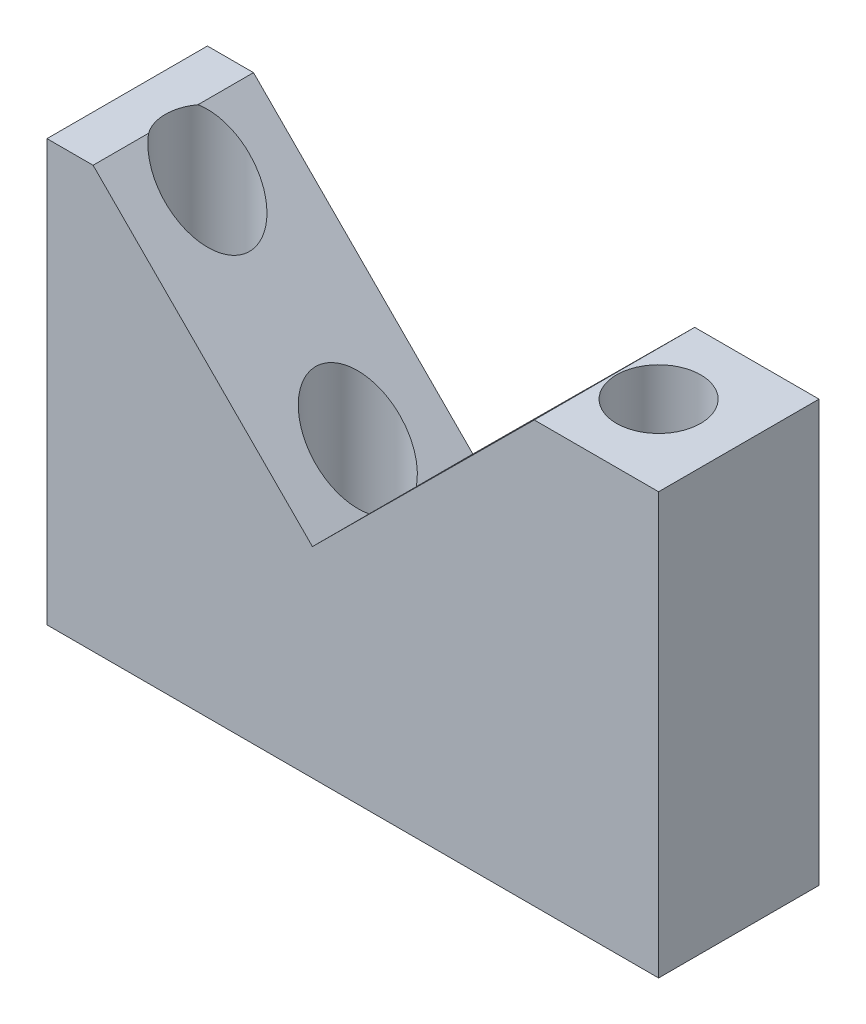
ISO-10303-21;
HEADER;
FILE_DESCRIPTION(('STEP AP214'),'2;1');
FILE_NAME('part.step','',(''),(''),'','','');
FILE_SCHEMA(('AUTOMOTIVE_DESIGN { 1 0 10303 214 1 1 1 1 }'));
ENDSEC;
DATA;
#1=APPLICATION_CONTEXT('core data for automotive mechanical design processes');
#2=APPLICATION_PROTOCOL_DEFINITION('international standard','automotive_design',2000,#1);
#3=PRODUCT_CONTEXT('',#1,'mechanical');
#4=PRODUCT('Part','Part','',(#3));
#5=PRODUCT_RELATED_PRODUCT_CATEGORY('part','',(#4));
#6=PRODUCT_DEFINITION_FORMATION('','',#4);
#7=PRODUCT_DEFINITION_CONTEXT('part definition',#1,'design');
#8=PRODUCT_DEFINITION('design','',#6,#7);
#9=PRODUCT_DEFINITION_SHAPE('','',#8);
#10=(LENGTH_UNIT() NAMED_UNIT(*) SI_UNIT(.MILLI.,.METRE.));
#11=(NAMED_UNIT(*) PLANE_ANGLE_UNIT() SI_UNIT($,.RADIAN.));
#12=(NAMED_UNIT(*) SI_UNIT($,.STERADIAN.) SOLID_ANGLE_UNIT());
#13=UNCERTAINTY_MEASURE_WITH_UNIT(LENGTH_MEASURE(1.E-05),#10,'distance_accuracy_value','');
#14=(GEOMETRIC_REPRESENTATION_CONTEXT(3) GLOBAL_UNCERTAINTY_ASSIGNED_CONTEXT((#13)) GLOBAL_UNIT_ASSIGNED_CONTEXT((#10,
#11,#12)) REPRESENTATION_CONTEXT('',''));
#15=CARTESIAN_POINT('',(0.,0.,0.));
#16=DIRECTION('',(0.,0.,1.));
#17=DIRECTION('',(1.,0.,0.));
#18=AXIS2_PLACEMENT_3D('',#15,#16,#17);
#19=CARTESIAN_POINT('',(-19.5,4.,0.));
#20=DIRECTION('',(1.,0.,0.));
#21=DIRECTION('',(0.,0.,-1.));
#22=AXIS2_PLACEMENT_3D('',#19,#20,#21);
#23=CYLINDRICAL_SURFACE('',#22,2.1);
#24=CARTESIAN_POINT('',(16.,4.,0.));
#25=DIRECTION('',(1.,0.,0.));
#26=DIRECTION('',(0.,0.,-1.));
#27=AXIS2_PLACEMENT_3D('',#24,#25,#26);
#28=CIRCLE('',#27,2.1);
#29=CARTESIAN_POINT('',(16.,5.,1.84661853126194));
#30=VERTEX_POINT('',#29);
#31=CARTESIAN_POINT('',(16.,3.,1.84661853126194));
#32=VERTEX_POINT('',#31);
#33=EDGE_CURVE('E55',#30,#32,#28,.T.);
#34=ORIENTED_EDGE('',*,*,#33,.T.);
#35=CARTESIAN_POINT('',(15.,4.,0.));
#36=DIRECTION('',(-0.707106781186548,-0.707106781186547,0.));
#37=DIRECTION('',(0.707106781186548,-0.707106781186547,0.));
#38=AXIS2_PLACEMENT_3D('',#35,#36,#37);
#39=ELLIPSE('',#38,2.9698484809835,2.1);
#40=CARTESIAN_POINT('',(15.,4.,2.1));
#41=VERTEX_POINT('',#40);
#42=EDGE_CURVE('E283',#32,#41,#39,.T.);
#43=ORIENTED_EDGE('',*,*,#42,.T.);
#44=CARTESIAN_POINT('',(15.,4.,0.));
#45=DIRECTION('',(0.707106781186548,-0.707106781186547,0.));
#46=DIRECTION('',(-0.707106781186548,-0.707106781186547,0.));
#47=AXIS2_PLACEMENT_3D('',#44,#45,#46);
#48=ELLIPSE('',#47,2.9698484809835,2.1);
#49=EDGE_CURVE('E293',#41,#30,#48,.F.);
#50=ORIENTED_EDGE('',*,*,#49,.T.);
#51=EDGE_LOOP('',(#34,#43,#50));
#52=FACE_BOUND('',#51,.T.);
#53=ADVANCED_FACE('F39',(#52),#23,.F.);
#54=CARTESIAN_POINT('',(16.,3.,-1.84661853126193));
#55=VERTEX_POINT('',#54);
#56=CARTESIAN_POINT('',(16.,5.,-1.84661853126193));
#57=VERTEX_POINT('',#56);
#58=EDGE_CURVE('E231',#55,#57,#28,.T.);
#59=ORIENTED_EDGE('',*,*,#58,.T.);
#60=CARTESIAN_POINT('',(15.,4.,-2.1));
#61=VERTEX_POINT('',#60);
#62=EDGE_CURVE('E292',#57,#61,#48,.F.);
#63=ORIENTED_EDGE('',*,*,#62,.T.);
#64=EDGE_CURVE('E284',#61,#55,#39,.T.);
#65=ORIENTED_EDGE('',*,*,#64,.T.);
#66=EDGE_LOOP('',(#59,#63,#65));
#67=FACE_BOUND('',#66,.T.);
#68=ADVANCED_FACE('F572',(#67),#23,.F.);
#69=CARTESIAN_POINT('',(15.,21.,0.));
#70=DIRECTION('',(0.,-1.,0.));
#71=DIRECTION('',(0.,0.,-1.));
#72=AXIS2_PLACEMENT_3D('',#69,#70,#71);
#73=CYLINDRICAL_SURFACE('',#72,2.1);
#74=CARTESIAN_POINT('',(17.,2.,0.640312423743293));
#75=VERTEX_POINT('',#74);
#76=EDGE_CURVE('E226',#75,#32,#39,.T.);
#77=ORIENTED_EDGE('',*,*,#76,.F.);
#78=CARTESIAN_POINT('',(15.,2.,0.));
#79=DIRECTION('',(0.,-1.,0.));
#80=DIRECTION('',(0.,0.,-1.));
#81=AXIS2_PLACEMENT_3D('',#78,#79,#80);
#82=CIRCLE('',#81,2.1);
#83=CARTESIAN_POINT('',(13.,2.,0.640312423743291));
#84=VERTEX_POINT('',#83);
#85=EDGE_CURVE('E208',#75,#84,#82,.T.);
#86=ORIENTED_EDGE('',*,*,#85,.T.);
#87=CARTESIAN_POINT('',(15.,4.,0.));
#88=DIRECTION('',(0.707106781186548,-0.707106781186547,0.));
#89=DIRECTION('',(-0.707106781186548,-0.707106781186547,0.));
#90=AXIS2_PLACEMENT_3D('',#87,#88,#89);
#91=ELLIPSE('',#90,2.9698484809835,2.1);
#92=EDGE_CURVE('E288',#41,#84,#91,.T.);
#93=ORIENTED_EDGE('',*,*,#92,.F.);
#94=ORIENTED_EDGE('',*,*,#42,.F.);
#95=EDGE_LOOP('',(#77,#86,#93,#94));
#96=FACE_BOUND('',#95,.T.);
#97=ADVANCED_FACE('F577',(#96),#73,.F.);
#98=CARTESIAN_POINT('',(13.,2.,-0.64031242374328));
#99=VERTEX_POINT('',#98);
#100=EDGE_CURVE('E287',#99,#61,#91,.T.);
#101=ORIENTED_EDGE('',*,*,#100,.F.);
#102=CARTESIAN_POINT('',(17.,2.,-0.640312423743278));
#103=VERTEX_POINT('',#102);
#104=EDGE_CURVE('E243',#99,#103,#82,.T.);
#105=ORIENTED_EDGE('',*,*,#104,.T.);
#106=CARTESIAN_POINT('',(15.,4.,0.));
#107=DIRECTION('',(-0.707106781186548,-0.707106781186547,0.));
#108=DIRECTION('',(0.707106781186548,-0.707106781186547,0.));
#109=AXIS2_PLACEMENT_3D('',#106,#107,#108);
#110=ELLIPSE('',#109,2.9698484809835,2.1);
#111=EDGE_CURVE('E63',#55,#103,#110,.T.);
#112=ORIENTED_EDGE('',*,*,#111,.F.);
#113=ORIENTED_EDGE('',*,*,#64,.F.);
#114=EDGE_LOOP('',(#101,#105,#112,#113));
#115=FACE_BOUND('',#114,.T.);
#116=ADVANCED_FACE('F637',(#115),#73,.F.);
#117=CARTESIAN_POINT('',(7.5,21.,0.));
#118=DIRECTION('',(0.,-1.,0.));
#119=DIRECTION('',(0.,0.,-1.));
#120=AXIS2_PLACEMENT_3D('',#117,#118,#119);
#121=CYLINDRICAL_SURFACE('',#120,2.1);
#122=CARTESIAN_POINT('',(7.5,4.,0.));
#123=DIRECTION('',(-0.707106781186548,-0.707106781186547,0.));
#124=DIRECTION('',(0.707106781186548,-0.707106781186547,0.));
#125=AXIS2_PLACEMENT_3D('',#122,#123,#124);
#126=ELLIPSE('',#125,2.9698484809835,2.1);
#127=CARTESIAN_POINT('',(9.5,2.,0.64031242374329));
#128=VERTEX_POINT('',#127);
#129=CARTESIAN_POINT('',(7.5,4.,2.1));
#130=VERTEX_POINT('',#129);
#131=EDGE_CURVE('E437',#128,#130,#126,.T.);
#132=ORIENTED_EDGE('',*,*,#131,.F.);
#133=CARTESIAN_POINT('',(7.5,2.,0.));
#134=DIRECTION('',(0.,-1.,0.));
#135=DIRECTION('',(0.,0.,-1.));
#136=AXIS2_PLACEMENT_3D('',#133,#134,#135);
#137=CIRCLE('',#136,2.1);
#138=CARTESIAN_POINT('',(5.5,2.,0.640312423743288));
#139=VERTEX_POINT('',#138);
#140=EDGE_CURVE('E256',#128,#139,#137,.T.);
#141=ORIENTED_EDGE('',*,*,#140,.T.);
#142=CARTESIAN_POINT('',(7.5,4.,0.));
#143=DIRECTION('',(0.707106781186548,-0.707106781186547,0.));
#144=DIRECTION('',(-0.707106781186548,-0.707106781186547,0.));
#145=AXIS2_PLACEMENT_3D('',#142,#143,#144);
#146=ELLIPSE('',#145,2.9698484809835,2.1);
#147=EDGE_CURVE('E444',#130,#139,#146,.T.);
#148=ORIENTED_EDGE('',*,*,#147,.F.);
#149=EDGE_LOOP('',(#132,#141,#148));
#150=FACE_BOUND('',#149,.T.);
#151=ADVANCED_FACE('F474',(#150),#121,.F.);
#152=CARTESIAN_POINT('',(5.5,2.,-0.640312423743283));
#153=VERTEX_POINT('',#152);
#154=CARTESIAN_POINT('',(7.5,4.,-2.1));
#155=VERTEX_POINT('',#154);
#156=EDGE_CURVE('E442',#153,#155,#146,.T.);
#157=ORIENTED_EDGE('',*,*,#156,.F.);
#158=CARTESIAN_POINT('',(9.5,2.,-0.640312423743282));
#159=VERTEX_POINT('',#158);
#160=EDGE_CURVE('E251',#153,#159,#137,.T.);
#161=ORIENTED_EDGE('',*,*,#160,.T.);
#162=EDGE_CURVE('E438',#155,#159,#126,.T.);
#163=ORIENTED_EDGE('',*,*,#162,.F.);
#164=EDGE_LOOP('',(#157,#161,#163));
#165=FACE_BOUND('',#164,.T.);
#166=ADVANCED_FACE('F461',(#165),#121,.F.);
#167=CARTESIAN_POINT('',(0.,21.,0.));
#168=DIRECTION('',(0.,-1.,0.));
#169=DIRECTION('',(0.,0.,-1.));
#170=AXIS2_PLACEMENT_3D('',#167,#168,#169);
#171=CYLINDRICAL_SURFACE('',#170,2.1);
#172=CARTESIAN_POINT('',(0.,4.,0.));
#173=DIRECTION('',(-0.707106781186548,-0.707106781186547,0.));
#174=DIRECTION('',(0.707106781186548,-0.707106781186547,0.));
#175=AXIS2_PLACEMENT_3D('',#172,#173,#174);
#176=ELLIPSE('',#175,2.9698484809835,2.1);
#177=CARTESIAN_POINT('',(2.,2.,0.640312423743287));
#178=VERTEX_POINT('',#177);
#179=CARTESIAN_POINT('',(0.,4.,2.1));
#180=VERTEX_POINT('',#179);
#181=EDGE_CURVE('E319',#178,#180,#176,.T.);
#182=ORIENTED_EDGE('',*,*,#181,.F.);
#183=CARTESIAN_POINT('',(0.,2.,0.));
#184=DIRECTION('',(0.,-1.,0.));
#185=DIRECTION('',(0.,0.,-1.));
#186=AXIS2_PLACEMENT_3D('',#183,#184,#185);
#187=CIRCLE('',#186,2.1);
#188=CARTESIAN_POINT('',(-2.,2.,0.640312423743285));
#189=VERTEX_POINT('',#188);
#190=EDGE_CURVE('E266',#178,#189,#187,.T.);
#191=ORIENTED_EDGE('',*,*,#190,.T.);
#192=CARTESIAN_POINT('',(0.,4.,0.));
#193=DIRECTION('',(0.707106781186548,-0.707106781186547,0.));
#194=DIRECTION('',(-0.707106781186548,-0.707106781186547,0.));
#195=AXIS2_PLACEMENT_3D('',#192,#193,#194);
#196=ELLIPSE('',#195,2.9698484809835,2.1);
#197=EDGE_CURVE('E325',#180,#189,#196,.T.);
#198=ORIENTED_EDGE('',*,*,#197,.F.);
#199=EDGE_LOOP('',(#182,#191,#198));
#200=FACE_BOUND('',#199,.T.);
#201=ADVANCED_FACE('F551',(#200),#171,.F.);
#202=CARTESIAN_POINT('',(-2.,2.,-0.640312423743287));
#203=VERTEX_POINT('',#202);
#204=CARTESIAN_POINT('',(0.,4.,-2.1));
#205=VERTEX_POINT('',#204);
#206=EDGE_CURVE('E324',#203,#205,#196,.T.);
#207=ORIENTED_EDGE('',*,*,#206,.F.);
#208=CARTESIAN_POINT('',(2.,2.,-0.640312423743285));
#209=VERTEX_POINT('',#208);
#210=EDGE_CURVE('E260',#203,#209,#187,.T.);
#211=ORIENTED_EDGE('',*,*,#210,.T.);
#212=EDGE_CURVE('E320',#205,#209,#176,.T.);
#213=ORIENTED_EDGE('',*,*,#212,.F.);
#214=EDGE_LOOP('',(#207,#211,#213));
#215=FACE_BOUND('',#214,.T.);
#216=ADVANCED_FACE('F540',(#215),#171,.F.);
#217=CARTESIAN_POINT('',(-7.5,21.,0.));
#218=DIRECTION('',(0.,-1.,0.));
#219=DIRECTION('',(0.,0.,-1.));
#220=AXIS2_PLACEMENT_3D('',#217,#218,#219);
#221=CYLINDRICAL_SURFACE('',#220,2.1);
#222=CARTESIAN_POINT('',(-7.5,4.,0.));
#223=DIRECTION('',(-0.707106781186548,-0.707106781186547,0.));
#224=DIRECTION('',(0.707106781186548,-0.707106781186547,0.));
#225=AXIS2_PLACEMENT_3D('',#222,#223,#224);
#226=ELLIPSE('',#225,2.9698484809835,2.1);
#227=CARTESIAN_POINT('',(-5.5,2.,0.640312423743283));
#228=VERTEX_POINT('',#227);
#229=CARTESIAN_POINT('',(-7.5,4.,2.1));
#230=VERTEX_POINT('',#229);
#231=EDGE_CURVE('E300',#228,#230,#226,.T.);
#232=ORIENTED_EDGE('',*,*,#231,.F.);
#233=CARTESIAN_POINT('',(-7.5,2.,0.));
#234=DIRECTION('',(0.,-1.,0.));
#235=DIRECTION('',(0.,0.,-1.));
#236=AXIS2_PLACEMENT_3D('',#233,#234,#235);
#237=CIRCLE('',#236,2.1);
#238=CARTESIAN_POINT('',(-9.5,2.,0.640312423743282));
#239=VERTEX_POINT('',#238);
#240=EDGE_CURVE('E275',#228,#239,#237,.T.);
#241=ORIENTED_EDGE('',*,*,#240,.T.);
#242=CARTESIAN_POINT('',(-7.5,4.,0.));
#243=DIRECTION('',(0.707106781186548,-0.707106781186547,0.));
#244=DIRECTION('',(-0.707106781186548,-0.707106781186547,0.));
#245=AXIS2_PLACEMENT_3D('',#242,#243,#244);
#246=ELLIPSE('',#245,2.9698484809835,2.1);
#247=EDGE_CURVE('E307',#230,#239,#246,.T.);
#248=ORIENTED_EDGE('',*,*,#247,.F.);
#249=EDGE_LOOP('',(#232,#241,#248));
#250=FACE_BOUND('',#249,.T.);
#251=ADVANCED_FACE('F614',(#250),#221,.F.);
#252=CARTESIAN_POINT('',(-9.5,2.,-0.64031242374329));
#253=VERTEX_POINT('',#252);
#254=CARTESIAN_POINT('',(-7.5,4.,-2.1));
#255=VERTEX_POINT('',#254);
#256=EDGE_CURVE('E305',#253,#255,#246,.T.);
#257=ORIENTED_EDGE('',*,*,#256,.F.);
#258=CARTESIAN_POINT('',(-5.5,2.,-0.640312423743288));
#259=VERTEX_POINT('',#258);
#260=EDGE_CURVE('E270',#253,#259,#237,.T.);
#261=ORIENTED_EDGE('',*,*,#260,.T.);
#262=EDGE_CURVE('E301',#255,#259,#226,.T.);
#263=ORIENTED_EDGE('',*,*,#262,.F.);
#264=EDGE_LOOP('',(#257,#261,#263));
#265=FACE_BOUND('',#264,.T.);
#266=ADVANCED_FACE('F623',(#265),#221,.F.);
#267=CARTESIAN_POINT('',(0.,4.,0.));
#268=DIRECTION('',(0.707106781186548,-0.707106781186547,0.));
#269=DIRECTION('',(-0.707106781186548,-0.707106781186547,0.));
#270=AXIS2_PLACEMENT_3D('',#267,#268,#269);
#271=ELLIPSE('',#270,2.9698484809835,2.1);
#272=EDGE_CURVE('E329',#180,#205,#271,.F.);
#273=ORIENTED_EDGE('',*,*,#272,.F.);
#274=CARTESIAN_POINT('',(0.,4.,0.));
#275=DIRECTION('',(-0.707106781186548,-0.707106781186547,0.));
#276=DIRECTION('',(0.707106781186548,-0.707106781186547,0.));
#277=AXIS2_PLACEMENT_3D('',#274,#275,#276);
#278=ELLIPSE('',#277,2.9698484809835,2.1);
#279=EDGE_CURVE('E315',#205,#180,#278,.F.);
#280=ORIENTED_EDGE('',*,*,#279,.F.);
#281=EDGE_LOOP('',(#273,#280));
#282=FACE_BOUND('',#281,.T.);
#283=CARTESIAN_POINT('',(0.,8.27128979281552,0.));
#284=DIRECTION('',(0.705129412033409,-0.709078636178964,0.));
#285=DIRECTION('',(-0.709078636178964,-0.705129412033409,0.));
#286=AXIS2_PLACEMENT_3D('',#283,#284,#285);
#287=ELLIPSE('',#286,2.96158972059339,2.1);
#288=CARTESIAN_POINT('',(1.73839220877791,10.,-1.17813094707687));
#289=VERTEX_POINT('',#288);
#290=CARTESIAN_POINT('',(1.73839220877791,10.,1.17813094707687));
#291=VERTEX_POINT('',#290);
#292=EDGE_CURVE('E358',#289,#291,#287,.T.);
#293=ORIENTED_EDGE('',*,*,#292,.F.);
#294=CARTESIAN_POINT('',(0.,11.7481284364379,0.));
#295=DIRECTION('',(-0.709078636178956,-0.705129412033417,0.));
#296=DIRECTION('',(0.705129412033417,-0.709078636178956,0.));
#297=AXIS2_PLACEMENT_3D('',#294,#295,#296);
#298=ELLIPSE('',#297,2.9781767207017,2.1);
#299=EDGE_CURVE('E366',#291,#289,#298,.T.);
#300=ORIENTED_EDGE('',*,*,#299,.F.);
#301=EDGE_LOOP('',(#293,#300));
#302=FACE_BOUND('',#301,.T.);
#303=ADVANCED_FACE('F497',(#282,#302),#171,.F.);
#304=CARTESIAN_POINT('',(-7.5,4.,0.));
#305=DIRECTION('',(0.707106781186548,-0.707106781186547,0.));
#306=DIRECTION('',(-0.707106781186548,-0.707106781186547,0.));
#307=AXIS2_PLACEMENT_3D('',#304,#305,#306);
#308=ELLIPSE('',#307,2.9698484809835,2.1);
#309=EDGE_CURVE('E311',#230,#255,#308,.F.);
#310=ORIENTED_EDGE('',*,*,#309,.F.);
#311=CARTESIAN_POINT('',(-7.5,4.,0.));
#312=DIRECTION('',(-0.707106781186548,-0.707106781186547,0.));
#313=DIRECTION('',(0.707106781186548,-0.707106781186547,0.));
#314=AXIS2_PLACEMENT_3D('',#311,#312,#313);
#315=ELLIPSE('',#314,2.9698484809835,2.1);
#316=EDGE_CURVE('E296',#255,#230,#315,.F.);
#317=ORIENTED_EDGE('',*,*,#316,.F.);
#318=EDGE_LOOP('',(#310,#317));
#319=FACE_BOUND('',#318,.T.);
#320=CARTESIAN_POINT('',(-7.5,19.2901337486346,0.));
#321=DIRECTION('',(-0.709078636178956,-0.705129412033417,0.));
#322=DIRECTION('',(0.705129412033417,-0.709078636178956,0.));
#323=AXIS2_PLACEMENT_3D('',#320,#321,#322);
#324=ELLIPSE('',#323,2.9781767207017,2.1);
#325=CARTESIAN_POINT('',(-9.20034312552149,21.,-1.23240953237623));
#326=VERTEX_POINT('',#325);
#327=CARTESIAN_POINT('',(-9.20034312552149,21.,1.23240953237623));
#328=VERTEX_POINT('',#327);
#329=EDGE_CURVE('E427',#326,#328,#324,.T.);
#330=ORIENTED_EDGE('',*,*,#329,.F.);
#331=CARTESIAN_POINT('',(-7.5,21.,0.));
#332=DIRECTION('',(0.,1.,0.));
#333=DIRECTION('',(0.,0.,1.));
#334=AXIS2_PLACEMENT_3D('',#331,#332,#333);
#335=CIRCLE('',#334,2.1);
#336=EDGE_CURVE('E377',#326,#328,#335,.T.);
#337=ORIENTED_EDGE('',*,*,#336,.T.);
#338=EDGE_LOOP('',(#330,#337));
#339=FACE_BOUND('',#338,.T.);
#340=ADVANCED_FACE('F619',(#319,#339),#221,.F.);
#341=ORIENTED_EDGE('',*,*,#49,.F.);
#342=CARTESIAN_POINT('',(15.,4.,0.));
#343=DIRECTION('',(-0.707106781186548,-0.707106781186547,0.));
#344=DIRECTION('',(0.707106781186548,-0.707106781186547,0.));
#345=AXIS2_PLACEMENT_3D('',#342,#343,#344);
#346=ELLIPSE('',#345,2.9698484809835,2.1);
#347=EDGE_CURVE('E279',#61,#41,#346,.F.);
#348=ORIENTED_EDGE('',*,*,#347,.F.);
#349=ORIENTED_EDGE('',*,*,#62,.F.);
#350=CARTESIAN_POINT('',(15.,4.,0.));
#351=DIRECTION('',(0.707106781186548,-0.707106781186547,0.));
#352=DIRECTION('',(-0.707106781186548,-0.707106781186547,0.));
#353=AXIS2_PLACEMENT_3D('',#350,#351,#352);
#354=ELLIPSE('',#353,2.9698484809835,2.1);
#355=EDGE_CURVE('E237',#30,#57,#354,.F.);
#356=ORIENTED_EDGE('',*,*,#355,.F.);
#357=EDGE_LOOP('',(#341,#348,#349,#356));
#358=FACE_BOUND('',#357,.T.);
#359=CARTESIAN_POINT('',(15.,21.,0.));
#360=DIRECTION('',(0.,1.,0.));
#361=DIRECTION('',(0.,0.,1.));
#362=AXIS2_PLACEMENT_3D('',#359,#360,#361);
#363=CIRCLE('',#362,2.1);
#364=CARTESIAN_POINT('',(15.,21.,2.1));
#365=VERTEX_POINT('',#364);
#366=EDGE_CURVE('E373',#365,#365,#363,.T.);
#367=ORIENTED_EDGE('',*,*,#366,.T.);
#368=EDGE_LOOP('',(#367));
#369=FACE_BOUND('',#368,.T.);
#370=ADVANCED_FACE('F481',(#358,#369),#73,.F.);
#371=CARTESIAN_POINT('',(7.5,4.,0.));
#372=DIRECTION('',(0.707106781186548,-0.707106781186547,0.));
#373=DIRECTION('',(-0.707106781186548,-0.707106781186547,0.));
#374=AXIS2_PLACEMENT_3D('',#371,#372,#373);
#375=ELLIPSE('',#374,2.9698484809835,2.1);
#376=EDGE_CURVE('E48',#130,#155,#375,.F.);
#377=ORIENTED_EDGE('',*,*,#376,.F.);
#378=CARTESIAN_POINT('',(7.5,4.,0.));
#379=DIRECTION('',(-0.707106781186548,-0.707106781186547,0.));
#380=DIRECTION('',(0.707106781186548,-0.707106781186547,0.));
#381=AXIS2_PLACEMENT_3D('',#378,#379,#380);
#382=ELLIPSE('',#381,2.9698484809835,2.1);
#383=EDGE_CURVE('E433',#155,#130,#382,.F.);
#384=ORIENTED_EDGE('',*,*,#383,.F.);
#385=EDGE_LOOP('',(#377,#384));
#386=FACE_BOUND('',#385,.T.);
#387=CARTESIAN_POINT('',(7.5,15.7295184298377,0.));
#388=DIRECTION('',(0.705129412033409,-0.709078636178964,0.));
#389=DIRECTION('',(-0.709078636178964,-0.705129412033409,0.));
#390=AXIS2_PLACEMENT_3D('',#387,#388,#389);
#391=ELLIPSE('',#390,2.96158972059339,2.1);
#392=CARTESIAN_POINT('',(5.4,13.6412144114715,0.));
#393=VERTEX_POINT('',#392);
#394=EDGE_CURVE('E350',#393,#393,#391,.T.);
#395=ORIENTED_EDGE('',*,*,#394,.F.);
#396=EDGE_LOOP('',(#395));
#397=FACE_BOUND('',#396,.T.);
#398=ADVANCED_FACE('F477',(#386,#397),#121,.F.);
#399=CARTESIAN_POINT('',(0.,21.,0.));
#400=DIRECTION('',(0.,1.,0.));
#401=DIRECTION('',(0.,0.,1.));
#402=AXIS2_PLACEMENT_3D('',#399,#400,#401);
#403=PLANE('',#402);
#404=DIRECTION('',(0.,0.,1.));
#405=VECTOR('',#404,1.);
#406=CARTESIAN_POINT('',(12.8,21.,-13.5));
#407=LINE('',#406,#405);
#408=CARTESIAN_POINT('',(12.8,21.,-4.));
#409=VERTEX_POINT('',#408);
#410=CARTESIAN_POINT('',(12.8,21.,4.));
#411=VERTEX_POINT('',#410);
#412=EDGE_CURVE('E346',#409,#411,#407,.T.);
#413=ORIENTED_EDGE('',*,*,#412,.T.);
#414=DIRECTION('',(1.,0.,0.));
#415=VECTOR('',#414,1.);
#416=CARTESIAN_POINT('',(-11.5,21.,4.));
#417=LINE('',#416,#415);
#418=CARTESIAN_POINT('',(19.,21.,4.));
#419=VERTEX_POINT('',#418);
#420=EDGE_CURVE('E386',#411,#419,#417,.T.);
#421=ORIENTED_EDGE('',*,*,#420,.T.);
#422=DIRECTION('',(0.,0.,-1.));
#423=VECTOR('',#422,1.);
#424=CARTESIAN_POINT('',(19.,21.,-4.));
#425=LINE('',#424,#423);
#426=CARTESIAN_POINT('',(19.,21.,-4.));
#427=VERTEX_POINT('',#426);
#428=EDGE_CURVE('E392',#419,#427,#425,.T.);
#429=ORIENTED_EDGE('',*,*,#428,.T.);
#430=DIRECTION('',(-1.,0.,0.));
#431=VECTOR('',#430,1.);
#432=CARTESIAN_POINT('',(-11.5,21.,-4.));
#433=LINE('',#432,#431);
#434=EDGE_CURVE('E396',#427,#409,#433,.T.);
#435=ORIENTED_EDGE('',*,*,#434,.T.);
#436=EDGE_LOOP('',(#413,#421,#429,#435));
#437=FACE_BOUND('',#436,.T.);
#438=ORIENTED_EDGE('',*,*,#366,.F.);
#439=EDGE_LOOP('',(#438));
#440=FACE_BOUND('',#439,.T.);
#441=ADVANCED_FACE('F480',(#437,#440),#403,.T.);
#442=DIRECTION('',(0.,0.,1.));
#443=VECTOR('',#442,1.);
#444=CARTESIAN_POINT('',(-9.20034312552149,21.,-13.5));
#445=LINE('',#444,#443);
#446=CARTESIAN_POINT('',(-9.20034312552149,21.,-4.));
#447=VERTEX_POINT('',#446);
#448=EDGE_CURVE('E355',#447,#326,#445,.T.);
#449=ORIENTED_EDGE('',*,*,#448,.F.);
#450=CARTESIAN_POINT('',(-11.5,21.,-4.));
#451=VERTEX_POINT('',#450);
#452=EDGE_CURVE('E395',#447,#451,#433,.T.);
#453=ORIENTED_EDGE('',*,*,#452,.T.);
#454=DIRECTION('',(0.,0.,1.));
#455=VECTOR('',#454,1.);
#456=CARTESIAN_POINT('',(-11.5,21.,-4.));
#457=LINE('',#456,#455);
#458=CARTESIAN_POINT('',(-11.5,21.,4.));
#459=VERTEX_POINT('',#458);
#460=EDGE_CURVE('E382',#451,#459,#457,.T.);
#461=ORIENTED_EDGE('',*,*,#460,.T.);
#462=CARTESIAN_POINT('',(-9.20034312552149,21.,4.));
#463=VERTEX_POINT('',#462);
#464=EDGE_CURVE('E388',#459,#463,#417,.T.);
#465=ORIENTED_EDGE('',*,*,#464,.T.);
#466=EDGE_CURVE('E345',#328,#463,#445,.T.);
#467=ORIENTED_EDGE('',*,*,#466,.F.);
#468=ORIENTED_EDGE('',*,*,#336,.F.);
#469=EDGE_LOOP('',(#449,#453,#461,#465,#467,#468));
#470=FACE_BOUND('',#469,.T.);
#471=ADVANCED_FACE('F688',(#470),#403,.T.);
#472=CARTESIAN_POINT('',(0.,0.,0.));
#473=DIRECTION('',(0.,1.,0.));
#474=DIRECTION('',(0.,0.,1.));
#475=AXIS2_PLACEMENT_3D('',#472,#473,#474);
#476=PLANE('',#475);
#477=DIRECTION('',(0.,0.,1.));
#478=VECTOR('',#477,1.);
#479=CARTESIAN_POINT('',(-11.5,0.,-4.));
#480=LINE('',#479,#478);
#481=CARTESIAN_POINT('',(-11.5,0.,-4.));
#482=VERTEX_POINT('',#481);
#483=CARTESIAN_POINT('',(-11.5,0.,4.));
#484=VERTEX_POINT('',#483);
#485=EDGE_CURVE('E381',#482,#484,#480,.T.);
#486=ORIENTED_EDGE('',*,*,#485,.F.);
#487=DIRECTION('',(-1.,0.,0.));
#488=VECTOR('',#487,1.);
#489=CARTESIAN_POINT('',(-11.5,0.,-4.));
#490=LINE('',#489,#488);
#491=CARTESIAN_POINT('',(19.,0.,-4.));
#492=VERTEX_POINT('',#491);
#493=EDGE_CURVE('E387',#492,#482,#490,.T.);
#494=ORIENTED_EDGE('',*,*,#493,.F.);
#495=DIRECTION('',(0.,0.,-1.));
#496=VECTOR('',#495,1.);
#497=CARTESIAN_POINT('',(19.,0.,-4.));
#498=LINE('',#497,#496);
#499=CARTESIAN_POINT('',(19.,0.,4.));
#500=VERTEX_POINT('',#499);
#501=EDGE_CURVE('E407',#500,#492,#498,.T.);
#502=ORIENTED_EDGE('',*,*,#501,.F.);
#503=DIRECTION('',(1.,0.,0.));
#504=VECTOR('',#503,1.);
#505=CARTESIAN_POINT('',(-11.5,0.,4.));
#506=LINE('',#505,#504);
#507=EDGE_CURVE('E404',#484,#500,#506,.T.);
#508=ORIENTED_EDGE('',*,*,#507,.F.);
#509=EDGE_LOOP('',(#486,#494,#502,#508));
#510=FACE_BOUND('',#509,.T.);
#511=ADVANCED_FACE('F703',(#510),#476,.F.);
#512=CARTESIAN_POINT('',(-11.5,21.,-4.));
#513=DIRECTION('',(1.,0.,0.));
#514=DIRECTION('',(0.,0.,-1.));
#515=AXIS2_PLACEMENT_3D('',#512,#513,#514);
#516=PLANE('',#515);
#517=CARTESIAN_POINT('',(-11.5,4.,0.));
#518=DIRECTION('',(1.,0.,0.));
#519=DIRECTION('',(0.,0.,-1.));
#520=AXIS2_PLACEMENT_3D('',#517,#518,#519);
#521=CIRCLE('',#520,2.1);
#522=CARTESIAN_POINT('',(-11.5,4.,-2.1));
#523=VERTEX_POINT('',#522);
#524=EDGE_CURVE('E334',#523,#523,#521,.T.);
#525=ORIENTED_EDGE('',*,*,#524,.T.);
#526=EDGE_LOOP('',(#525));
#527=FACE_BOUND('',#526,.T.);
#528=ORIENTED_EDGE('',*,*,#485,.T.);
#529=DIRECTION('',(0.,-1.,0.));
#530=VECTOR('',#529,1.);
#531=CARTESIAN_POINT('',(-11.5,21.,4.));
#532=LINE('',#531,#530);
#533=EDGE_CURVE('E423',#459,#484,#532,.T.);
#534=ORIENTED_EDGE('',*,*,#533,.F.);
#535=ORIENTED_EDGE('',*,*,#460,.F.);
#536=DIRECTION('',(0.,-1.,0.));
#537=VECTOR('',#536,1.);
#538=CARTESIAN_POINT('',(-11.5,21.,-4.));
#539=LINE('',#538,#537);
#540=EDGE_CURVE('E400',#451,#482,#539,.T.);
#541=ORIENTED_EDGE('',*,*,#540,.T.);
#542=EDGE_LOOP('',(#528,#534,#535,#541));
#543=FACE_BOUND('',#542,.T.);
#544=ADVANCED_FACE('F41',(#527,#543),#516,.F.);
#545=CARTESIAN_POINT('',(-11.5,21.,4.));
#546=DIRECTION('',(0.,0.,-1.));
#547=DIRECTION('',(-1.,0.,0.));
#548=AXIS2_PLACEMENT_3D('',#545,#546,#547);
#549=PLANE('',#548);
#550=ORIENTED_EDGE('',*,*,#420,.F.);
#551=DIRECTION('',(0.709078636178964,0.705129412033409,0.));
#552=VECTOR('',#551,1.);
#553=CARTESIAN_POINT('',(12.8,21.,4.));
#554=LINE('',#553,#552);
#555=CARTESIAN_POINT('',(1.73839220877791,10.,4.));
#556=VERTEX_POINT('',#555);
#557=EDGE_CURVE('E342',#556,#411,#554,.T.);
#558=ORIENTED_EDGE('',*,*,#557,.F.);
#559=DIRECTION('',(0.705129412033417,-0.709078636178956,0.));
#560=VECTOR('',#559,1.);
#561=CARTESIAN_POINT('',(1.73839220877791,10.,4.));
#562=LINE('',#561,#560);
#563=EDGE_CURVE('E338',#463,#556,#562,.T.);
#564=ORIENTED_EDGE('',*,*,#563,.F.);
#565=ORIENTED_EDGE('',*,*,#464,.F.);
#566=ORIENTED_EDGE('',*,*,#533,.T.);
#567=ORIENTED_EDGE('',*,*,#507,.T.);
#568=DIRECTION('',(0.,-1.,0.));
#569=VECTOR('',#568,1.);
#570=CARTESIAN_POINT('',(19.,21.,4.));
#571=LINE('',#570,#569);
#572=EDGE_CURVE('E419',#419,#500,#571,.T.);
#573=ORIENTED_EDGE('',*,*,#572,.F.);
#574=EDGE_LOOP('',(#550,#558,#564,#565,#566,#567,#573));
#575=FACE_BOUND('',#574,.T.);
#576=ADVANCED_FACE('F506',(#575),#549,.F.);
#577=CARTESIAN_POINT('',(19.,21.,-4.));
#578=DIRECTION('',(-1.,0.,0.));
#579=DIRECTION('',(0.,0.,1.));
#580=AXIS2_PLACEMENT_3D('',#577,#578,#579);
#581=PLANE('',#580);
#582=ORIENTED_EDGE('',*,*,#501,.T.);
#583=DIRECTION('',(0.,-1.,0.));
#584=VECTOR('',#583,1.);
#585=CARTESIAN_POINT('',(19.,21.,-4.));
#586=LINE('',#585,#584);
#587=EDGE_CURVE('E415',#427,#492,#586,.T.);
#588=ORIENTED_EDGE('',*,*,#587,.F.);
#589=ORIENTED_EDGE('',*,*,#428,.F.);
#590=ORIENTED_EDGE('',*,*,#572,.T.);
#591=EDGE_LOOP('',(#582,#588,#589,#590));
#592=FACE_BOUND('',#591,.T.);
#593=ADVANCED_FACE('F704',(#592),#581,.F.);
#594=CARTESIAN_POINT('',(-11.5,21.,-4.));
#595=DIRECTION('',(0.,0.,1.));
#596=DIRECTION('',(1.,0.,0.));
#597=AXIS2_PLACEMENT_3D('',#594,#595,#596);
#598=PLANE('',#597);
#599=DIRECTION('',(0.705129412033417,-0.709078636178956,0.));
#600=VECTOR('',#599,1.);
#601=CARTESIAN_POINT('',(-10.3437497426865,22.149810504088,-4.));
#602=LINE('',#601,#600);
#603=CARTESIAN_POINT('',(1.73839220877791,10.,-4.));
#604=VERTEX_POINT('',#603);
#605=EDGE_CURVE('E369',#447,#604,#602,.T.);
#606=ORIENTED_EDGE('',*,*,#605,.T.);
#607=DIRECTION('',(0.709078636178964,0.705129412033409,0.));
#608=VECTOR('',#607,1.);
#609=CARTESIAN_POINT('',(0.582141951464308,8.85018949591193,-4.));
#610=LINE('',#609,#608);
#611=EDGE_CURVE('E362',#604,#409,#610,.T.);
#612=ORIENTED_EDGE('',*,*,#611,.T.);
#613=ORIENTED_EDGE('',*,*,#434,.F.);
#614=ORIENTED_EDGE('',*,*,#587,.T.);
#615=ORIENTED_EDGE('',*,*,#493,.T.);
#616=ORIENTED_EDGE('',*,*,#540,.F.);
#617=ORIENTED_EDGE('',*,*,#452,.F.);
#618=EDGE_LOOP('',(#606,#612,#613,#614,#615,#616,#617));
#619=FACE_BOUND('',#618,.T.);
#620=ADVANCED_FACE('F693',(#619),#598,.F.);
#621=CARTESIAN_POINT('',(1.73839220877791,10.,-13.5));
#622=DIRECTION('',(-0.709078636178956,-0.705129412033417,0.));
#623=DIRECTION('',(0.705129412033417,-0.709078636178956,0.));
#624=AXIS2_PLACEMENT_3D('',#621,#622,#623);
#625=PLANE('',#624);
#626=ORIENTED_EDGE('',*,*,#448,.T.);
#627=ORIENTED_EDGE('',*,*,#329,.T.);
#628=ORIENTED_EDGE('',*,*,#466,.T.);
#629=ORIENTED_EDGE('',*,*,#563,.T.);
#630=DIRECTION('',(0.,0.,1.));
#631=VECTOR('',#630,1.);
#632=CARTESIAN_POINT('',(1.73839220877791,10.,-13.5));
#633=LINE('',#632,#631);
#634=EDGE_CURVE('E352',#291,#556,#633,.T.);
#635=ORIENTED_EDGE('',*,*,#634,.F.);
#636=ORIENTED_EDGE('',*,*,#299,.T.);
#637=EDGE_CURVE('E351',#604,#289,#633,.T.);
#638=ORIENTED_EDGE('',*,*,#637,.F.);
#639=ORIENTED_EDGE('',*,*,#605,.F.);
#640=EDGE_LOOP('',(#626,#627,#628,#629,#635,#636,#638,#639));
#641=FACE_BOUND('',#640,.T.);
#642=ADVANCED_FACE('F488',(#641),#625,.F.);
#643=CARTESIAN_POINT('',(12.8,21.,-13.5));
#644=DIRECTION('',(0.705129412033409,-0.709078636178964,0.));
#645=DIRECTION('',(0.709078636178964,0.705129412033409,0.));
#646=AXIS2_PLACEMENT_3D('',#643,#644,#645);
#647=PLANE('',#646);
#648=ORIENTED_EDGE('',*,*,#394,.T.);
#649=EDGE_LOOP('',(#648));
#650=FACE_BOUND('',#649,.T.);
#651=ORIENTED_EDGE('',*,*,#637,.T.);
#652=ORIENTED_EDGE('',*,*,#292,.T.);
#653=ORIENTED_EDGE('',*,*,#634,.T.);
#654=ORIENTED_EDGE('',*,*,#557,.T.);
#655=ORIENTED_EDGE('',*,*,#412,.F.);
#656=ORIENTED_EDGE('',*,*,#611,.F.);
#657=EDGE_LOOP('',(#651,#652,#653,#654,#655,#656));
#658=FACE_BOUND('',#657,.T.);
#659=ADVANCED_FACE('F485',(#650,#658),#647,.F.);
#660=ORIENTED_EDGE('',*,*,#272,.T.);
#661=ORIENTED_EDGE('',*,*,#212,.T.);
#662=CARTESIAN_POINT('',(0.,4.,0.));
#663=DIRECTION('',(0.707106781186547,0.707106781186547,0.));
#664=DIRECTION('',(0.707106781186547,-0.707106781186547,0.));
#665=AXIS2_PLACEMENT_3D('',#662,#663,#664);
#666=ELLIPSE('',#665,2.9698484809835,2.1);
#667=EDGE_CURVE('E265',#209,#178,#666,.F.);
#668=ORIENTED_EDGE('',*,*,#667,.T.);
#669=ORIENTED_EDGE('',*,*,#181,.T.);
#670=EDGE_LOOP('',(#660,#661,#668,#669));
#671=FACE_BOUND('',#670,.T.);
#672=ORIENTED_EDGE('',*,*,#147,.T.);
#673=CARTESIAN_POINT('',(7.5,4.,0.));
#674=DIRECTION('',(0.707106781186547,-0.707106781186547,0.));
#675=DIRECTION('',(0.707106781186547,0.707106781186547,0.));
#676=AXIS2_PLACEMENT_3D('',#673,#674,#675);
#677=ELLIPSE('',#676,2.9698484809835,2.1);
#678=EDGE_CURVE('E255',#139,#153,#677,.T.);
#679=ORIENTED_EDGE('',*,*,#678,.T.);
#680=ORIENTED_EDGE('',*,*,#156,.T.);
#681=ORIENTED_EDGE('',*,*,#383,.T.);
#682=EDGE_LOOP('',(#672,#679,#680,#681));
#683=FACE_BOUND('',#682,.T.);
#684=ADVANCED_FACE('F476',(#671,#683),#23,.F.);
#685=ORIENTED_EDGE('',*,*,#92,.T.);
#686=CARTESIAN_POINT('',(15.,4.,0.));
#687=DIRECTION('',(0.707106781186547,-0.707106781186547,0.));
#688=DIRECTION('',(0.707106781186547,0.707106781186547,0.));
#689=AXIS2_PLACEMENT_3D('',#686,#687,#688);
#690=ELLIPSE('',#689,2.9698484809835,2.1);
#691=EDGE_CURVE('E247',#84,#99,#690,.T.);
#692=ORIENTED_EDGE('',*,*,#691,.T.);
#693=ORIENTED_EDGE('',*,*,#100,.T.);
#694=ORIENTED_EDGE('',*,*,#347,.T.);
#695=EDGE_LOOP('',(#685,#692,#693,#694));
#696=FACE_BOUND('',#695,.T.);
#697=ORIENTED_EDGE('',*,*,#376,.T.);
#698=ORIENTED_EDGE('',*,*,#162,.T.);
#699=EDGE_CURVE('E443',#159,#128,#126,.T.);
#700=ORIENTED_EDGE('',*,*,#699,.T.);
#701=ORIENTED_EDGE('',*,*,#131,.T.);
#702=EDGE_LOOP('',(#697,#698,#700,#701));
#703=FACE_BOUND('',#702,.T.);
#704=ADVANCED_FACE('F452',(#696,#703),#23,.F.);
#705=ORIENTED_EDGE('',*,*,#247,.T.);
#706=CARTESIAN_POINT('',(-7.5,4.,0.));
#707=DIRECTION('',(0.707106781186547,-0.707106781186547,0.));
#708=DIRECTION('',(0.707106781186547,0.707106781186547,0.));
#709=AXIS2_PLACEMENT_3D('',#706,#707,#708);
#710=ELLIPSE('',#709,2.9698484809835,2.1);
#711=EDGE_CURVE('E274',#239,#253,#710,.T.);
#712=ORIENTED_EDGE('',*,*,#711,.T.);
#713=ORIENTED_EDGE('',*,*,#256,.T.);
#714=ORIENTED_EDGE('',*,*,#316,.T.);
#715=EDGE_LOOP('',(#705,#712,#713,#714));
#716=FACE_BOUND('',#715,.T.);
#717=ORIENTED_EDGE('',*,*,#524,.F.);
#718=EDGE_LOOP('',(#717));
#719=FACE_BOUND('',#718,.T.);
#720=ADVANCED_FACE('F579',(#716,#719),#23,.F.);
#721=ORIENTED_EDGE('',*,*,#197,.T.);
#722=EDGE_CURVE('E330',#189,#203,#196,.T.);
#723=ORIENTED_EDGE('',*,*,#722,.T.);
#724=ORIENTED_EDGE('',*,*,#206,.T.);
#725=ORIENTED_EDGE('',*,*,#279,.T.);
#726=EDGE_LOOP('',(#721,#723,#724,#725));
#727=FACE_BOUND('',#726,.T.);
#728=ORIENTED_EDGE('',*,*,#309,.T.);
#729=ORIENTED_EDGE('',*,*,#262,.T.);
#730=EDGE_CURVE('E306',#259,#228,#226,.T.);
#731=ORIENTED_EDGE('',*,*,#730,.T.);
#732=ORIENTED_EDGE('',*,*,#231,.T.);
#733=EDGE_LOOP('',(#728,#729,#731,#732));
#734=FACE_BOUND('',#733,.T.);
#735=ADVANCED_FACE('F553',(#727,#734),#23,.F.);
#736=CARTESIAN_POINT('',(-7.5,2.,0.));
#737=DIRECTION('',(0.,-1.,0.));
#738=DIRECTION('',(0.,0.,-1.));
#739=AXIS2_PLACEMENT_3D('',#736,#737,#738);
#740=PLANE('',#739);
#741=EDGE_CURVE('E271',#259,#228,#237,.T.);
#742=ORIENTED_EDGE('',*,*,#741,.F.);
#743=ORIENTED_EDGE('',*,*,#260,.F.);
#744=EDGE_CURVE('E526',#239,#253,#237,.T.);
#745=ORIENTED_EDGE('',*,*,#744,.F.);
#746=ORIENTED_EDGE('',*,*,#240,.F.);
#747=EDGE_LOOP('',(#742,#743,#745,#746));
#748=FACE_BOUND('',#747,.T.);
#749=ADVANCED_FACE('F591',(#748),#740,.F.);
#750=CARTESIAN_POINT('',(-7.5,2.,0.));
#751=DIRECTION('',(0.,-1.,0.));
#752=DIRECTION('',(0.,0.,-1.));
#753=AXIS2_PLACEMENT_3D('',#750,#751,#752);
#754=CYLINDRICAL_SURFACE('',#753,2.1);
#755=ORIENTED_EDGE('',*,*,#730,.F.);
#756=ORIENTED_EDGE('',*,*,#741,.T.);
#757=EDGE_LOOP('',(#755,#756));
#758=FACE_BOUND('',#757,.T.);
#759=ADVANCED_FACE('F595',(#758),#754,.T.);
#760=ORIENTED_EDGE('',*,*,#711,.F.);
#761=ORIENTED_EDGE('',*,*,#744,.T.);
#762=EDGE_LOOP('',(#760,#761));
#763=FACE_BOUND('',#762,.T.);
#764=ADVANCED_FACE('F600',(#763),#754,.T.);
#765=CARTESIAN_POINT('',(0.,2.,0.));
#766=DIRECTION('',(0.,-1.,0.));
#767=DIRECTION('',(0.,0.,-1.));
#768=AXIS2_PLACEMENT_3D('',#765,#766,#767);
#769=PLANE('',#768);
#770=EDGE_CURVE('E261',#209,#178,#187,.T.);
#771=ORIENTED_EDGE('',*,*,#770,.F.);
#772=ORIENTED_EDGE('',*,*,#210,.F.);
#773=EDGE_CURVE('E533',#189,#203,#187,.T.);
#774=ORIENTED_EDGE('',*,*,#773,.F.);
#775=ORIENTED_EDGE('',*,*,#190,.F.);
#776=EDGE_LOOP('',(#771,#772,#774,#775));
#777=FACE_BOUND('',#776,.T.);
#778=ADVANCED_FACE('F557',(#777),#769,.F.);
#779=CARTESIAN_POINT('',(0.,2.,0.));
#780=DIRECTION('',(0.,-1.,0.));
#781=DIRECTION('',(0.,0.,-1.));
#782=AXIS2_PLACEMENT_3D('',#779,#780,#781);
#783=CYLINDRICAL_SURFACE('',#782,2.1);
#784=ORIENTED_EDGE('',*,*,#722,.F.);
#785=ORIENTED_EDGE('',*,*,#773,.T.);
#786=EDGE_LOOP('',(#784,#785));
#787=FACE_BOUND('',#786,.T.);
#788=ADVANCED_FACE('F556',(#787),#783,.T.);
#789=ORIENTED_EDGE('',*,*,#667,.F.);
#790=ORIENTED_EDGE('',*,*,#770,.T.);
#791=EDGE_LOOP('',(#789,#790));
#792=FACE_BOUND('',#791,.T.);
#793=ADVANCED_FACE('F559',(#792),#783,.T.);
#794=CARTESIAN_POINT('',(7.5,2.,0.));
#795=DIRECTION('',(0.,-1.,0.));
#796=DIRECTION('',(0.,0.,-1.));
#797=AXIS2_PLACEMENT_3D('',#794,#795,#796);
#798=PLANE('',#797);
#799=EDGE_CURVE('E252',#159,#128,#137,.T.);
#800=ORIENTED_EDGE('',*,*,#799,.F.);
#801=ORIENTED_EDGE('',*,*,#160,.F.);
#802=EDGE_CURVE('E467',#139,#153,#137,.T.);
#803=ORIENTED_EDGE('',*,*,#802,.F.);
#804=ORIENTED_EDGE('',*,*,#140,.F.);
#805=EDGE_LOOP('',(#800,#801,#803,#804));
#806=FACE_BOUND('',#805,.T.);
#807=ADVANCED_FACE('F561',(#806),#798,.F.);
#808=CARTESIAN_POINT('',(7.5,2.,0.));
#809=DIRECTION('',(0.,-1.,0.));
#810=DIRECTION('',(0.,0.,-1.));
#811=AXIS2_PLACEMENT_3D('',#808,#809,#810);
#812=CYLINDRICAL_SURFACE('',#811,2.1);
#813=ORIENTED_EDGE('',*,*,#699,.F.);
#814=ORIENTED_EDGE('',*,*,#799,.T.);
#815=EDGE_LOOP('',(#813,#814));
#816=FACE_BOUND('',#815,.T.);
#817=ADVANCED_FACE('F567',(#816),#812,.T.);
#818=ORIENTED_EDGE('',*,*,#678,.F.);
#819=ORIENTED_EDGE('',*,*,#802,.T.);
#820=EDGE_LOOP('',(#818,#819));
#821=FACE_BOUND('',#820,.T.);
#822=ADVANCED_FACE('F673',(#821),#812,.T.);
#823=CARTESIAN_POINT('',(15.,2.,0.));
#824=DIRECTION('',(0.,-1.,0.));
#825=DIRECTION('',(0.,0.,-1.));
#826=AXIS2_PLACEMENT_3D('',#823,#824,#825);
#827=PLANE('',#826);
#828=DIRECTION('',(0.,0.,1.));
#829=VECTOR('',#828,1.);
#830=CARTESIAN_POINT('',(16.,2.,0.));
#831=LINE('',#830,#829);
#832=CARTESIAN_POINT('',(16.,2.,-0.640312423743281));
#833=VERTEX_POINT('',#832);
#834=CARTESIAN_POINT('',(16.,2.,0.640312423743295));
#835=VERTEX_POINT('',#834);
#836=EDGE_CURVE('E11',#833,#835,#831,.T.);
#837=ORIENTED_EDGE('',*,*,#836,.F.);
#838=DIRECTION('',(1.,0.,0.));
#839=VECTOR('',#838,1.);
#840=CARTESIAN_POINT('',(16.,2.,-0.640312423743281));
#841=LINE('',#840,#839);
#842=EDGE_CURVE('E214',#833,#103,#841,.T.);
#843=ORIENTED_EDGE('',*,*,#842,.T.);
#844=ORIENTED_EDGE('',*,*,#104,.F.);
#845=EDGE_CURVE('E246',#84,#99,#82,.T.);
#846=ORIENTED_EDGE('',*,*,#845,.F.);
#847=ORIENTED_EDGE('',*,*,#85,.F.);
#848=DIRECTION('',(1.,0.,0.));
#849=VECTOR('',#848,1.);
#850=CARTESIAN_POINT('',(16.,2.,0.640312423743295));
#851=LINE('',#850,#849);
#852=EDGE_CURVE('E203',#75,#835,#851,.F.);
#853=ORIENTED_EDGE('',*,*,#852,.T.);
#854=EDGE_LOOP('',(#837,#843,#844,#846,#847,#853));
#855=FACE_BOUND('',#854,.T.);
#856=ADVANCED_FACE('F204',(#855),#827,.F.);
#857=CARTESIAN_POINT('',(15.,2.,0.));
#858=DIRECTION('',(0.,-1.,0.));
#859=DIRECTION('',(0.,0.,-1.));
#860=AXIS2_PLACEMENT_3D('',#857,#858,#859);
#861=CYLINDRICAL_SURFACE('',#860,2.1);
#862=ORIENTED_EDGE('',*,*,#691,.F.);
#863=ORIENTED_EDGE('',*,*,#845,.T.);
#864=EDGE_LOOP('',(#862,#863));
#865=FACE_BOUND('',#864,.T.);
#866=ADVANCED_FACE('F653',(#865),#861,.T.);
#867=CARTESIAN_POINT('',(16.,4.,0.));
#868=DIRECTION('',(1.,0.,0.));
#869=DIRECTION('',(0.,0.,-1.));
#870=AXIS2_PLACEMENT_3D('',#867,#868,#869);
#871=CYLINDRICAL_SURFACE('',#870,2.1);
#872=EDGE_CURVE('E215',#57,#30,#28,.T.);
#873=ORIENTED_EDGE('',*,*,#872,.T.);
#874=ORIENTED_EDGE('',*,*,#355,.T.);
#875=EDGE_LOOP('',(#873,#874));
#876=FACE_BOUND('',#875,.T.);
#877=ADVANCED_FACE('F659',(#876),#871,.T.);
#878=EDGE_CURVE('E224',#833,#55,#28,.T.);
#879=ORIENTED_EDGE('',*,*,#878,.T.);
#880=ORIENTED_EDGE('',*,*,#111,.T.);
#881=ORIENTED_EDGE('',*,*,#842,.F.);
#882=EDGE_LOOP('',(#879,#880,#881));
#883=FACE_BOUND('',#882,.T.);
#884=ADVANCED_FACE('F662',(#883),#871,.T.);
#885=ORIENTED_EDGE('',*,*,#852,.F.);
#886=ORIENTED_EDGE('',*,*,#76,.T.);
#887=EDGE_CURVE('E221',#32,#835,#28,.T.);
#888=ORIENTED_EDGE('',*,*,#887,.T.);
#889=EDGE_LOOP('',(#885,#886,#888));
#890=FACE_BOUND('',#889,.T.);
#891=ADVANCED_FACE('F225',(#890),#871,.T.);
#892=CARTESIAN_POINT('',(16.,4.,0.));
#893=DIRECTION('',(1.,0.,0.));
#894=DIRECTION('',(0.,0.,-1.));
#895=AXIS2_PLACEMENT_3D('',#892,#893,#894);
#896=PLANE('',#895);
#897=ORIENTED_EDGE('',*,*,#878,.F.);
#898=ORIENTED_EDGE('',*,*,#836,.T.);
#899=ORIENTED_EDGE('',*,*,#887,.F.);
#900=ORIENTED_EDGE('',*,*,#33,.F.);
#901=ORIENTED_EDGE('',*,*,#872,.F.);
#902=ORIENTED_EDGE('',*,*,#58,.F.);
#903=EDGE_LOOP('',(#897,#898,#899,#900,#901,#902));
#904=FACE_BOUND('',#903,.T.);
#905=ADVANCED_FACE('F220',(#904),#896,.F.);
#906=CLOSED_SHELL('',(#53,#68,#97,#116,#151,#166,#201,#216,#251,#266,#303,#340,#370,#398,#441,
#471,#511,#544,#576,#593,#620,#642,#659,#684,#704,#720,#735,#749,#759,#764,#778,#788,#793,#807,
#817,#822,#856,#866,#877,#884,#891,#905));
#907=MANIFOLD_SOLID_BREP('B2',#906);
#908=ADVANCED_BREP_SHAPE_REPRESENTATION('',(#18,#907),#14);
#909=SHAPE_DEFINITION_REPRESENTATION(#9,#908);
ENDSEC;
END-ISO-10303-21;
